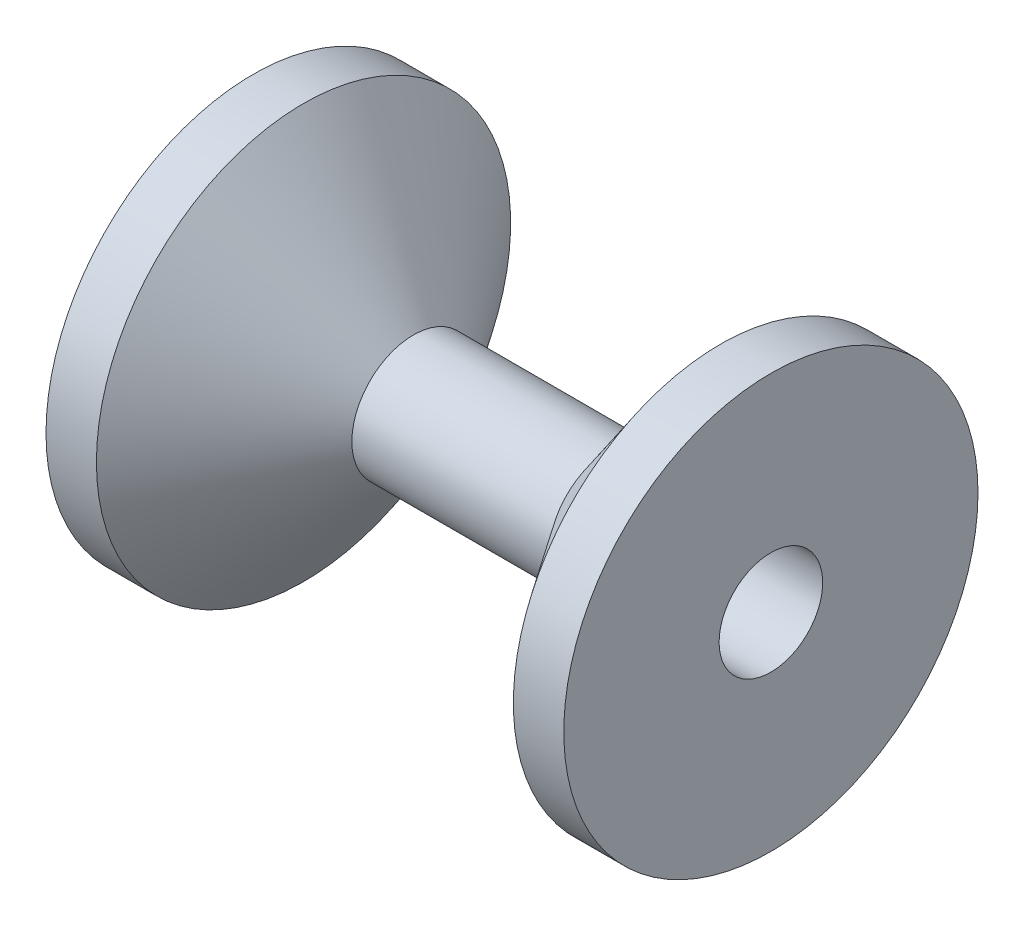
ISO-10303-21;
HEADER;
FILE_DESCRIPTION(('STEP AP214'),'2;1');
FILE_NAME('part.step','',(''),(''),'','','');
FILE_SCHEMA(('AUTOMOTIVE_DESIGN { 1 0 10303 214 1 1 1 1 }'));
ENDSEC;
DATA;
#1=APPLICATION_CONTEXT('core data for automotive mechanical design processes');
#2=APPLICATION_PROTOCOL_DEFINITION('international standard','automotive_design',2000,#1);
#3=PRODUCT_CONTEXT('',#1,'mechanical');
#4=PRODUCT('Part','Part','',(#3));
#5=PRODUCT_RELATED_PRODUCT_CATEGORY('part','',(#4));
#6=PRODUCT_DEFINITION_FORMATION('','',#4);
#7=PRODUCT_DEFINITION_CONTEXT('part definition',#1,'design');
#8=PRODUCT_DEFINITION('design','',#6,#7);
#9=PRODUCT_DEFINITION_SHAPE('','',#8);
#10=(LENGTH_UNIT() NAMED_UNIT(*) SI_UNIT(.MILLI.,.METRE.));
#11=(NAMED_UNIT(*) PLANE_ANGLE_UNIT() SI_UNIT($,.RADIAN.));
#12=(NAMED_UNIT(*) SI_UNIT($,.STERADIAN.) SOLID_ANGLE_UNIT());
#13=UNCERTAINTY_MEASURE_WITH_UNIT(LENGTH_MEASURE(1.E-05),#10,'distance_accuracy_value','');
#14=(GEOMETRIC_REPRESENTATION_CONTEXT(3) GLOBAL_UNCERTAINTY_ASSIGNED_CONTEXT((#13)) GLOBAL_UNIT_ASSIGNED_CONTEXT((#10,
#11,#12)) REPRESENTATION_CONTEXT('',''));
#15=CARTESIAN_POINT('',(0.,0.,0.));
#16=DIRECTION('',(0.,0.,1.));
#17=DIRECTION('',(1.,0.,0.));
#18=AXIS2_PLACEMENT_3D('',#15,#16,#17);
#19=CARTESIAN_POINT('',(100.,0.,0.));
#20=DIRECTION('',(-1.,0.,0.));
#21=DIRECTION('',(0.,0.,1.));
#22=AXIS2_PLACEMENT_3D('',#19,#20,#21);
#23=CYLINDRICAL_SURFACE('',#22,40.);
#24=CARTESIAN_POINT('',(100.,0.,0.));
#25=DIRECTION('',(1.,0.,0.));
#26=DIRECTION('',(0.,0.,-1.));
#27=AXIS2_PLACEMENT_3D('',#24,#25,#26);
#28=CIRCLE('',#27,40.);
#29=CARTESIAN_POINT('',(100.,0.,-40.));
#30=VERTEX_POINT('',#29);
#31=EDGE_CURVE('E10',#30,#30,#28,.T.);
#32=ORIENTED_EDGE('',*,*,#31,.F.);
#33=EDGE_LOOP('',(#32));
#34=FACE_BOUND('',#33,.T.);
#35=CARTESIAN_POINT('',(90.263107416723,0.,0.));
#36=DIRECTION('',(-1.,0.,0.));
#37=DIRECTION('',(0.,0.,1.));
#38=AXIS2_PLACEMENT_3D('',#35,#36,#37);
#39=CIRCLE('',#38,40.);
#40=CARTESIAN_POINT('',(90.263107416723,0.,-40.));
#41=VERTEX_POINT('',#40);
#42=EDGE_CURVE('E49',#41,#41,#39,.T.);
#43=ORIENTED_EDGE('',*,*,#42,.F.);
#44=EDGE_LOOP('',(#43));
#45=FACE_BOUND('',#44,.T.);
#46=ADVANCED_FACE('F37',(#34,#45),#23,.T.);
#47=CARTESIAN_POINT('',(100.,0.,0.));
#48=DIRECTION('',(1.,0.,0.));
#49=DIRECTION('',(0.,0.,-1.));
#50=AXIS2_PLACEMENT_3D('',#47,#48,#49);
#51=PLANE('',#50);
#52=CARTESIAN_POINT('',(100.,0.,0.));
#53=DIRECTION('',(-1.,0.,0.));
#54=DIRECTION('',(0.,0.,1.));
#55=AXIS2_PLACEMENT_3D('',#52,#53,#54);
#56=CIRCLE('',#55,10.);
#57=CARTESIAN_POINT('',(100.,0.,10.));
#58=VERTEX_POINT('',#57);
#59=EDGE_CURVE('E66',#58,#58,#56,.T.);
#60=ORIENTED_EDGE('',*,*,#59,.T.);
#61=EDGE_LOOP('',(#60));
#62=FACE_BOUND('',#61,.T.);
#63=ORIENTED_EDGE('',*,*,#31,.T.);
#64=EDGE_LOOP('',(#63));
#65=FACE_BOUND('',#64,.T.);
#66=ADVANCED_FACE('F75',(#62,#65),#51,.T.);
#67=CARTESIAN_POINT('',(69.0248506793057,0.,0.));
#68=DIRECTION('',(1.,0.,0.));
#69=DIRECTION('',(0.,0.,-1.));
#70=AXIS2_PLACEMENT_3D('',#67,#68,#69);
#71=CONICAL_SURFACE('',#70,11.9064444734676,0.923476937859792);
#72=CARTESIAN_POINT('',(69.0248506793057,0.,0.));
#73=DIRECTION('',(-1.,0.,0.));
#74=DIRECTION('',(0.,0.,1.));
#75=AXIS2_PLACEMENT_3D('',#72,#73,#74);
#76=CIRCLE('',#75,11.9064444734676);
#77=CARTESIAN_POINT('',(69.0248506793057,0.,-11.9064444734676));
#78=VERTEX_POINT('',#77);
#79=EDGE_CURVE('E54',#78,#78,#76,.T.);
#80=CARTESIAN_POINT('',(90.263107416723,0.,-40.));
#81=CARTESIAN_POINT('',(90.0418755757082,0.,-39.7073587965986));
#82=CARTESIAN_POINT('',(89.8206437346934,0.,-39.4147175931973));
#83=CARTESIAN_POINT('',(89.3781800526639,0.,-38.8294351863945));
#84=CARTESIAN_POINT('',(89.1569482116491,0.,-38.5367939829931));
#85=CARTESIAN_POINT('',(88.7144845296196,0.,-37.9515115761903));
#86=CARTESIAN_POINT('',(88.4932526886049,0.,-37.658870372789));
#87=CARTESIAN_POINT('',(88.0507890065753,0.,-37.0735879659862));
#88=CARTESIAN_POINT('',(87.8295571655606,0.,-36.7809467625848));
#89=CARTESIAN_POINT('',(87.387093483531,0.,-36.1956643557821));
#90=CARTESIAN_POINT('',(87.1658616425163,0.,-35.9030231523807));
#91=CARTESIAN_POINT('',(86.7233979604867,0.,-35.3177407455779));
#92=CARTESIAN_POINT('',(86.502166119472,0.,-35.0250995421766));
#93=CARTESIAN_POINT('',(86.0597024374425,0.,-34.4398171353738));
#94=CARTESIAN_POINT('',(85.8384705964277,0.,-34.1471759319724));
#95=CARTESIAN_POINT('',(85.3960069143982,0.,-33.5618935251697));
#96=CARTESIAN_POINT('',(85.1747750733834,0.,-33.2692523217683));
#97=CARTESIAN_POINT('',(84.7323113913539,0.,-32.6839699149655));
#98=CARTESIAN_POINT('',(84.5110795503391,0.,-32.3913287115641));
#99=CARTESIAN_POINT('',(84.0686158683096,0.,-31.8060463047614));
#100=CARTESIAN_POINT('',(83.8473840272948,0.,-31.51340510136));
#101=CARTESIAN_POINT('',(83.4049203452653,0.,-30.9281226945572));
#102=CARTESIAN_POINT('',(83.1836885042505,0.,-30.6354814911559));
#103=CARTESIAN_POINT('',(82.741224822221,0.,-30.0501990843531));
#104=CARTESIAN_POINT('',(82.5199929812062,0.,-29.7575578809517));
#105=CARTESIAN_POINT('',(82.0775292991767,0.,-29.172275474149));
#106=CARTESIAN_POINT('',(81.8562974581619,0.,-28.8796342707476));
#107=CARTESIAN_POINT('',(81.4138337761324,0.,-28.2943518639448));
#108=CARTESIAN_POINT('',(81.1926019351177,0.,-28.0017106605434));
#109=CARTESIAN_POINT('',(80.7501382530882,0.,-27.4164282537407));
#110=CARTESIAN_POINT('',(80.5289064120734,0.,-27.1237870503393));
#111=CARTESIAN_POINT('',(80.0864427300439,0.,-26.5385046435366));
#112=CARTESIAN_POINT('',(79.8652108890291,0.,-26.2458634401352));
#113=CARTESIAN_POINT('',(79.4227472069996,0.,-25.6605810333324));
#114=CARTESIAN_POINT('',(79.2015153659848,0.,-25.367939829931));
#115=CARTESIAN_POINT('',(78.7590516839553,0.,-24.7826574231283));
#116=CARTESIAN_POINT('',(78.5378198429405,0.,-24.4900162197269));
#117=CARTESIAN_POINT('',(78.095356160911,0.,-23.9047338129241));
#118=CARTESIAN_POINT('',(77.8741243198962,0.,-23.6120926095228));
#119=CARTESIAN_POINT('',(77.4316606378667,0.,-23.02681020272));
#120=CARTESIAN_POINT('',(77.2104287968519,0.,-22.7341689993186));
#121=CARTESIAN_POINT('',(76.7679651148224,0.,-22.1488865925159));
#122=CARTESIAN_POINT('',(76.5467332738076,0.,-21.8562453891145));
#123=CARTESIAN_POINT('',(76.1042695917781,0.,-21.2709629823117));
#124=CARTESIAN_POINT('',(75.8830377507633,0.,-20.9783217789103));
#125=CARTESIAN_POINT('',(75.4405740687338,0.,-20.3930393721076));
#126=CARTESIAN_POINT('',(75.2193422277191,0.,-20.1003981687062));
#127=CARTESIAN_POINT('',(74.7768785456895,0.,-19.5151157619034));
#128=CARTESIAN_POINT('',(74.5556467046748,0.,-19.2224745585021));
#129=CARTESIAN_POINT('',(74.1131830226452,0.,-18.6371921516993));
#130=CARTESIAN_POINT('',(73.8919511816305,0.,-18.3445509482979));
#131=CARTESIAN_POINT('',(73.4494874996009,0.,-17.7592685414952));
#132=CARTESIAN_POINT('',(73.2282556585862,0.,-17.4666273380938));
#133=CARTESIAN_POINT('',(72.7857919765567,0.,-16.881344931291));
#134=CARTESIAN_POINT('',(72.5645601355419,0.,-16.5887037278896));
#135=CARTESIAN_POINT('',(72.1220964535124,0.,-16.0034213210869));
#136=CARTESIAN_POINT('',(71.9008646124976,0.,-15.7107801176855));
#137=CARTESIAN_POINT('',(71.4584009304681,0.,-15.1254977108827));
#138=CARTESIAN_POINT('',(71.2371690894533,0.,-14.8328565074814));
#139=CARTESIAN_POINT('',(70.7947054074238,0.,-14.2475741006786));
#140=CARTESIAN_POINT('',(70.573473566409,0.,-13.9549328972772));
#141=CARTESIAN_POINT('',(70.1310098843795,0.,-13.3696504904745));
#142=CARTESIAN_POINT('',(69.9097780433647,0.,-13.0770092870731));
#143=CARTESIAN_POINT('',(69.4673143613352,0.,-12.4917268802703));
#144=CARTESIAN_POINT('',(69.2460825203204,0.,-12.199085676869));
#145=CARTESIAN_POINT('',(69.0248506793057,0.,-11.9064444734676));
#146=B_SPLINE_CURVE_WITH_KNOTS('',3,(#80,#81,#82,#83,#84,#85,#86,#87,#88,#89,#90,#91,#92,#93,
#94,#95,#96,#97,#98,#99,#100,#101,#102,#103,#104,#105,#106,#107,#108,#109,#110,#111,#112,#113,
#114,#115,#116,#117,#118,#119,#120,#121,#122,#123,#124,#125,#126,#127,#128,#129,#130,#131,#132,
#133,#134,#135,#136,#137,#138,#139,#140,#141,#142,#143,#144,#145),.UNSPECIFIED.,.F.,.F.,(4,2,2,
2,2,2,2,2,2,2,2,2,2,2,2,2,2,2,2,2,2,2,2,2,2,2,2,2,2,2,2,2,4),(0.,1.10056422468791,
2.20112844937583,3.30169267406374,4.40225689875166,5.50282112343955,6.60338534812747,
7.70394957281537,8.80451379750329,9.9050780221912,11.0056422468791,12.106206471567,
13.2067706962549,14.3073349209428,15.4078991456308,16.5084633703187,17.6090275950066,
18.7095918196945,19.8101560443824,20.9107202690703,22.0112844937582,23.1118487184461,
24.2124129431341,25.312977167822,26.4135413925099,27.5141056171978,28.6146698418857,
29.7152340665736,30.8157982912615,31.9163625159494,33.0169267406373,34.1174909653253,
35.2180551900132),.UNSPECIFIED.);
#147=EDGE_CURVE('BSEAM101',#41,#78,#146,.T.);
#148=ORIENTED_EDGE('',*,*,#42,.T.);
#149=ORIENTED_EDGE('',*,*,#79,.F.);
#150=ORIENTED_EDGE('',*,*,#147,.T.);
#151=ORIENTED_EDGE('',*,*,#147,.F.);
#152=EDGE_LOOP('',(#148,#150,#149,#151));
#153=FACE_BOUND('',#152,.T.);
#154=ADVANCED_FACE('F101',(#153),#71,.T.);
#155=CARTESIAN_POINT('',(0.,0.,0.));
#156=DIRECTION('',(-1.,0.,0.));
#157=DIRECTION('',(0.,0.,1.));
#158=AXIS2_PLACEMENT_3D('',#155,#156,#157);
#159=CYLINDRICAL_SURFACE('',#158,11.9064444734676);
#160=ORIENTED_EDGE('',*,*,#79,.T.);
#161=EDGE_LOOP('',(#160));
#162=FACE_BOUND('',#161,.T.);
#163=CARTESIAN_POINT('',(30.9751493206943,0.,0.));
#164=DIRECTION('',(-1.,0.,0.));
#165=DIRECTION('',(0.,0.,1.));
#166=AXIS2_PLACEMENT_3D('',#163,#164,#165);
#167=CIRCLE('',#166,11.9064444734676);
#168=CARTESIAN_POINT('',(30.9751493206943,0.,11.9064444734676));
#169=VERTEX_POINT('',#168);
#170=EDGE_CURVE('E58',#169,#169,#167,.T.);
#171=ORIENTED_EDGE('',*,*,#170,.F.);
#172=EDGE_LOOP('',(#171));
#173=FACE_BOUND('',#172,.T.);
#174=ADVANCED_FACE('F95',(#162,#173),#159,.T.);
#175=CARTESIAN_POINT('',(9.73689258327705,0.,0.));
#176=DIRECTION('',(-1.,0.,0.));
#177=DIRECTION('',(0.,0.,1.));
#178=AXIS2_PLACEMENT_3D('',#175,#176,#177);
#179=CONICAL_SURFACE('',#178,40.,0.923476937859792);
#180=CARTESIAN_POINT('',(9.73689258327705,0.,0.));
#181=DIRECTION('',(-1.,0.,0.));
#182=DIRECTION('',(0.,0.,1.));
#183=AXIS2_PLACEMENT_3D('',#180,#181,#182);
#184=CIRCLE('',#183,40.);
#185=CARTESIAN_POINT('',(9.73689258327705,0.,40.));
#186=VERTEX_POINT('',#185);
#187=EDGE_CURVE('E62',#186,#186,#184,.T.);
#188=CARTESIAN_POINT('',(30.9751493206943,0.,11.9064444734676));
#189=CARTESIAN_POINT('',(30.7539174796796,0.,12.1990856768689));
#190=CARTESIAN_POINT('',(30.5326856386648,0.,12.4917268802703));
#191=CARTESIAN_POINT('',(30.0902219566353,0.,13.0770092870731));
#192=CARTESIAN_POINT('',(29.8689901156205,0.,13.3696504904745));
#193=CARTESIAN_POINT('',(29.426526433591,0.,13.9549328972772));
#194=CARTESIAN_POINT('',(29.2052945925762,0.,14.2475741006786));
#195=CARTESIAN_POINT('',(28.7628309105467,0.,14.8328565074814));
#196=CARTESIAN_POINT('',(28.5415990695319,0.,15.1254977108827));
#197=CARTESIAN_POINT('',(28.0991353875024,0.,15.7107801176855));
#198=CARTESIAN_POINT('',(27.8779035464877,0.,16.0034213210869));
#199=CARTESIAN_POINT('',(27.4354398644581,0.,16.5887037278896));
#200=CARTESIAN_POINT('',(27.2142080234434,0.,16.881344931291));
#201=CARTESIAN_POINT('',(26.7717443414138,0.,17.4666273380938));
#202=CARTESIAN_POINT('',(26.5505125003991,0.,17.7592685414952));
#203=CARTESIAN_POINT('',(26.1080488183695,0.,18.3445509482979));
#204=CARTESIAN_POINT('',(25.8868169773548,0.,18.6371921516993));
#205=CARTESIAN_POINT('',(25.4443532953253,0.,19.2224745585021));
#206=CARTESIAN_POINT('',(25.2231214543105,0.,19.5151157619034));
#207=CARTESIAN_POINT('',(24.780657772281,0.,20.1003981687062));
#208=CARTESIAN_POINT('',(24.5594259312662,0.,20.3930393721076));
#209=CARTESIAN_POINT('',(24.1169622492367,0.,20.9783217789103));
#210=CARTESIAN_POINT('',(23.8957304082219,0.,21.2709629823117));
#211=CARTESIAN_POINT('',(23.4532667261924,0.,21.8562453891145));
#212=CARTESIAN_POINT('',(23.2320348851776,0.,22.1488865925158));
#213=CARTESIAN_POINT('',(22.7895712031481,0.,22.7341689993186));
#214=CARTESIAN_POINT('',(22.5683393621333,0.,23.02681020272));
#215=CARTESIAN_POINT('',(22.1258756801038,0.,23.6120926095227));
#216=CARTESIAN_POINT('',(21.904643839089,0.,23.9047338129241));
#217=CARTESIAN_POINT('',(21.4621801570595,0.,24.4900162197269));
#218=CARTESIAN_POINT('',(21.2409483160447,0.,24.7826574231283));
#219=CARTESIAN_POINT('',(20.7984846340152,0.,25.367939829931));
#220=CARTESIAN_POINT('',(20.5772527930005,0.,25.6605810333324));
#221=CARTESIAN_POINT('',(20.1347891109709,0.,26.2458634401352));
#222=CARTESIAN_POINT('',(19.9135572699562,0.,26.5385046435365));
#223=CARTESIAN_POINT('',(19.4710935879266,0.,27.1237870503393));
#224=CARTESIAN_POINT('',(19.2498617469119,0.,27.4164282537407));
#225=CARTESIAN_POINT('',(18.8073980648823,0.,28.0017106605434));
#226=CARTESIAN_POINT('',(18.5861662238676,0.,28.2943518639448));
#227=CARTESIAN_POINT('',(18.1437025418381,0.,28.8796342707476));
#228=CARTESIAN_POINT('',(17.9224707008233,0.,29.172275474149));
#229=CARTESIAN_POINT('',(17.4800070187938,0.,29.7575578809517));
#230=CARTESIAN_POINT('',(17.258775177779,0.,30.0501990843531));
#231=CARTESIAN_POINT('',(16.8163114957495,0.,30.6354814911559));
#232=CARTESIAN_POINT('',(16.5950796547347,0.,30.9281226945572));
#233=CARTESIAN_POINT('',(16.1526159727052,0.,31.51340510136));
#234=CARTESIAN_POINT('',(15.9313841316904,0.,31.8060463047614));
#235=CARTESIAN_POINT('',(15.4889204496609,0.,32.3913287115641));
#236=CARTESIAN_POINT('',(15.2676886086461,0.,32.6839699149655));
#237=CARTESIAN_POINT('',(14.8252249266166,0.,33.2692523217683));
#238=CARTESIAN_POINT('',(14.6039930856018,0.,33.5618935251696));
#239=CARTESIAN_POINT('',(14.1615294035723,0.,34.1471759319724));
#240=CARTESIAN_POINT('',(13.9402975625576,0.,34.4398171353738));
#241=CARTESIAN_POINT('',(13.497833880528,0.,35.0250995421765));
#242=CARTESIAN_POINT('',(13.2766020395133,0.,35.3177407455779));
#243=CARTESIAN_POINT('',(12.8341383574837,0.,35.9030231523807));
#244=CARTESIAN_POINT('',(12.612906516469,0.,36.1956643557821));
#245=CARTESIAN_POINT('',(12.1704428344394,0.,36.7809467625848));
#246=CARTESIAN_POINT('',(11.9492109934247,0.,37.0735879659862));
#247=CARTESIAN_POINT('',(11.5067473113952,0.,37.658870372789));
#248=CARTESIAN_POINT('',(11.2855154703804,0.,37.9515115761903));
#249=CARTESIAN_POINT('',(10.8430517883509,0.,38.5367939829931));
#250=CARTESIAN_POINT('',(10.6218199473361,0.,38.8294351863945));
#251=CARTESIAN_POINT('',(10.1793562653066,0.,39.4147175931972));
#252=CARTESIAN_POINT('',(9.95812442429181,0.,39.7073587965986));
#253=CARTESIAN_POINT('',(9.73689258327705,0.,40.));
#254=B_SPLINE_CURVE_WITH_KNOTS('',3,(#188,#189,#190,#191,#192,#193,#194,#195,#196,#197,#198,
#199,#200,#201,#202,#203,#204,#205,#206,#207,#208,#209,#210,#211,#212,#213,#214,#215,#216,#217,
#218,#219,#220,#221,#222,#223,#224,#225,#226,#227,#228,#229,#230,#231,#232,#233,#234,#235,#236,
#237,#238,#239,#240,#241,#242,#243,#244,#245,#246,#247,#248,#249,#250,#251,#252,#253),
.UNSPECIFIED.,.F.,.F.,(4,2,2,2,2,2,2,2,2,2,2,2,2,2,2,2,2,2,2,2,2,2,2,2,2,2,2,2,2,2,2,2,4),(0.,
1.10056422468791,2.20112844937582,3.30169267406373,4.40225689875165,5.50282112343955,
6.60338534812747,7.70394957281538,8.80451379750329,9.9050780221912,11.0056422468791,
12.106206471567,13.2067706962549,14.3073349209428,15.4078991456308,16.5084633703187,
17.6090275950066,18.7095918196945,19.8101560443824,20.9107202690703,22.0112844937582,
23.1118487184461,24.212412943134,25.312977167822,26.4135413925099,27.5141056171978,
28.6146698418857,29.7152340665736,30.8157982912615,31.9163625159494,33.0169267406373,
34.1174909653252,35.2180551900132),.UNSPECIFIED.);
#255=EDGE_CURVE('BSEAM87',#169,#186,#254,.T.);
#256=ORIENTED_EDGE('',*,*,#170,.T.);
#257=ORIENTED_EDGE('',*,*,#187,.F.);
#258=ORIENTED_EDGE('',*,*,#255,.T.);
#259=ORIENTED_EDGE('',*,*,#255,.F.);
#260=EDGE_LOOP('',(#256,#258,#257,#259));
#261=FACE_BOUND('',#260,.T.);
#262=ADVANCED_FACE('F87',(#261),#179,.T.);
#263=CARTESIAN_POINT('',(0.,0.,0.));
#264=DIRECTION('',(1.,0.,0.));
#265=DIRECTION('',(0.,0.,-1.));
#266=AXIS2_PLACEMENT_3D('',#263,#264,#265);
#267=PLANE('',#266);
#268=CARTESIAN_POINT('',(0.,0.,0.));
#269=DIRECTION('',(-1.,0.,0.));
#270=DIRECTION('',(0.,0.,1.));
#271=AXIS2_PLACEMENT_3D('',#268,#269,#270);
#272=CIRCLE('',#271,10.);
#273=CARTESIAN_POINT('',(0.,0.,10.));
#274=VERTEX_POINT('',#273);
#275=EDGE_CURVE('E67',#274,#274,#272,.T.);
#276=ORIENTED_EDGE('',*,*,#275,.F.);
#277=EDGE_LOOP('',(#276));
#278=FACE_BOUND('',#277,.T.);
#279=CARTESIAN_POINT('',(0.,0.,0.));
#280=DIRECTION('',(1.,0.,0.));
#281=DIRECTION('',(0.,0.,-1.));
#282=AXIS2_PLACEMENT_3D('',#279,#280,#281);
#283=CIRCLE('',#282,40.);
#284=CARTESIAN_POINT('',(0.,0.,-40.));
#285=VERTEX_POINT('',#284);
#286=EDGE_CURVE('E40',#285,#285,#283,.T.);
#287=ORIENTED_EDGE('',*,*,#286,.F.);
#288=EDGE_LOOP('',(#287));
#289=FACE_BOUND('',#288,.T.);
#290=ADVANCED_FACE('F84',(#278,#289),#267,.F.);
#291=ORIENTED_EDGE('',*,*,#286,.T.);
#292=EDGE_LOOP('',(#291));
#293=FACE_BOUND('',#292,.T.);
#294=ORIENTED_EDGE('',*,*,#187,.T.);
#295=EDGE_LOOP('',(#294));
#296=FACE_BOUND('',#295,.T.);
#297=ADVANCED_FACE('F80',(#293,#296),#23,.T.);
#298=CARTESIAN_POINT('',(100.,0.,0.));
#299=DIRECTION('',(-1.,0.,0.));
#300=DIRECTION('',(0.,0.,1.));
#301=AXIS2_PLACEMENT_3D('',#298,#299,#300);
#302=CYLINDRICAL_SURFACE('',#301,10.);
#303=ORIENTED_EDGE('',*,*,#59,.F.);
#304=EDGE_LOOP('',(#303));
#305=FACE_BOUND('',#304,.T.);
#306=ORIENTED_EDGE('',*,*,#275,.T.);
#307=EDGE_LOOP('',(#306));
#308=FACE_BOUND('',#307,.T.);
#309=ADVANCED_FACE('F77',(#305,#308),#302,.F.);
#310=CLOSED_SHELL('',(#46,#66,#154,#174,#262,#290,#297,#309));
#311=MANIFOLD_SOLID_BREP('B2',#310);
#312=ADVANCED_BREP_SHAPE_REPRESENTATION('',(#18,#311),#14);
#313=SHAPE_DEFINITION_REPRESENTATION(#9,#312);
ENDSEC;
END-ISO-10303-21;
